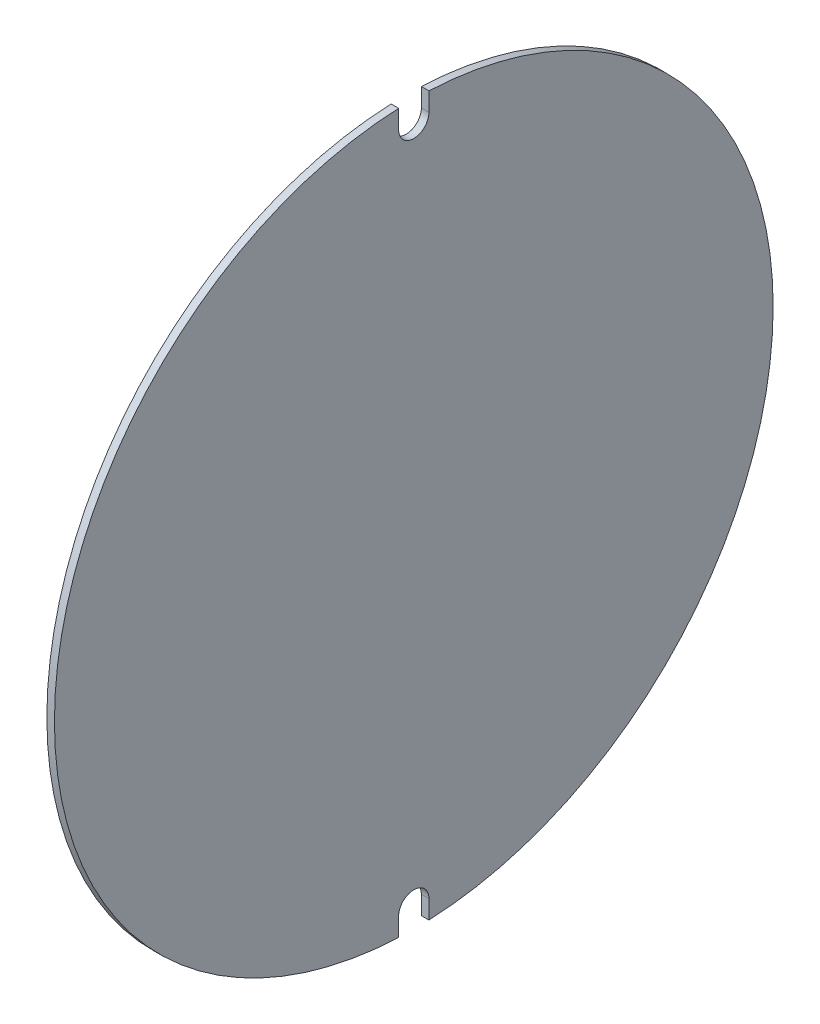
ISO-10303-21;
HEADER;
FILE_DESCRIPTION(('STEP AP214'),'2;1');
FILE_NAME('part.step','',(''),(''),'','','');
FILE_SCHEMA(('AUTOMOTIVE_DESIGN { 1 0 10303 214 1 1 1 1 }'));
ENDSEC;
DATA;
#1=APPLICATION_CONTEXT('core data for automotive mechanical design processes');
#2=APPLICATION_PROTOCOL_DEFINITION('international standard','automotive_design',2000,#1);
#3=PRODUCT_CONTEXT('',#1,'mechanical');
#4=PRODUCT('Part','Part','',(#3));
#5=PRODUCT_RELATED_PRODUCT_CATEGORY('part','',(#4));
#6=PRODUCT_DEFINITION_FORMATION('','',#4);
#7=PRODUCT_DEFINITION_CONTEXT('part definition',#1,'design');
#8=PRODUCT_DEFINITION('design','',#6,#7);
#9=PRODUCT_DEFINITION_SHAPE('','',#8);
#10=(LENGTH_UNIT() NAMED_UNIT(*) SI_UNIT(.MILLI.,.METRE.));
#11=(NAMED_UNIT(*) PLANE_ANGLE_UNIT() SI_UNIT($,.RADIAN.));
#12=(NAMED_UNIT(*) SI_UNIT($,.STERADIAN.) SOLID_ANGLE_UNIT());
#13=UNCERTAINTY_MEASURE_WITH_UNIT(LENGTH_MEASURE(1.E-05),#10,'distance_accuracy_value','');
#14=(GEOMETRIC_REPRESENTATION_CONTEXT(3) GLOBAL_UNCERTAINTY_ASSIGNED_CONTEXT((#13)) GLOBAL_UNIT_ASSIGNED_CONTEXT((#10,
#11,#12)) REPRESENTATION_CONTEXT('',''));
#15=CARTESIAN_POINT('',(0.,0.,0.));
#16=DIRECTION('',(0.,0.,1.));
#17=DIRECTION('',(1.,0.,0.));
#18=AXIS2_PLACEMENT_3D('',#15,#16,#17);
#19=CARTESIAN_POINT('',(0.,1.24344978758018E-13,0.));
#20=DIRECTION('',(1.,0.,0.));
#21=DIRECTION('',(0.,1.,0.));
#22=AXIS2_PLACEMENT_3D('',#19,#20,#21);
#23=PLANE('',#22);
#24=DIRECTION('',(0.,1.,0.));
#25=VECTOR('',#24,1.);
#26=CARTESIAN_POINT('',(0.,-47.4578760586691,2.0000000000001));
#27=LINE('',#26,#25);
#28=CARTESIAN_POINT('',(0.,-47.4578760586691,2.0000000000001));
#29=VERTEX_POINT('',#28);
#30=CARTESIAN_POINT('',(0.,-45.,2.));
#31=VERTEX_POINT('',#30);
#32=EDGE_CURVE('E28',#29,#31,#27,.T.);
#33=ORIENTED_EDGE('',*,*,#32,.F.);
#34=CARTESIAN_POINT('',(0.,0.,0.));
#35=DIRECTION('',(1.,0.,0.));
#36=DIRECTION('',(0.,0.999113180182513,0.0421052631577773));
#37=AXIS2_PLACEMENT_3D('',#34,#35,#36);
#38=CIRCLE('',#37,47.5);
#39=CARTESIAN_POINT('',(0.,47.4578760586694,1.99999999999442));
#40=VERTEX_POINT('',#39);
#41=EDGE_CURVE('E124',#40,#29,#38,.T.);
#42=ORIENTED_EDGE('',*,*,#41,.F.);
#43=DIRECTION('',(0.,1.,0.));
#44=VECTOR('',#43,1.);
#45=CARTESIAN_POINT('',(0.,44.9555335859783,1.99999999999457));
#46=LINE('',#45,#44);
#47=CARTESIAN_POINT('',(0.,45.,2.));
#48=VERTEX_POINT('',#47);
#49=EDGE_CURVE('E106',#48,#40,#46,.T.);
#50=ORIENTED_EDGE('',*,*,#49,.F.);
#51=CARTESIAN_POINT('',(0.,45.,0.));
#52=DIRECTION('',(-1.,0.,0.));
#53=DIRECTION('',(0.,0.,-1.));
#54=AXIS2_PLACEMENT_3D('',#51,#52,#53);
#55=CIRCLE('',#54,2.);
#56=CARTESIAN_POINT('',(0.,45.,-2.));
#57=VERTEX_POINT('',#56);
#58=EDGE_CURVE('E165',#57,#48,#55,.T.);
#59=ORIENTED_EDGE('',*,*,#58,.F.);
#60=DIRECTION('',(0.,-1.,0.));
#61=VECTOR('',#60,1.);
#62=CARTESIAN_POINT('',(0.,47.4578760586692,-1.99999999999777));
#63=LINE('',#62,#61);
#64=CARTESIAN_POINT('',(0.,47.4578760586692,-1.99999999999777));
#65=VERTEX_POINT('',#64);
#66=EDGE_CURVE('E155',#65,#57,#63,.T.);
#67=ORIENTED_EDGE('',*,*,#66,.F.);
#68=CARTESIAN_POINT('',(0.,0.,0.));
#69=DIRECTION('',(1.,0.,0.));
#70=DIRECTION('',(0.,-0.999113180182508,-0.0421052631578962));
#71=AXIS2_PLACEMENT_3D('',#68,#69,#70);
#72=CIRCLE('',#71,47.5);
#73=CARTESIAN_POINT('',(0.,-47.4578760586691,-2.00000000000007));
#74=VERTEX_POINT('',#73);
#75=EDGE_CURVE('E137',#74,#65,#72,.T.);
#76=ORIENTED_EDGE('',*,*,#75,.F.);
#77=DIRECTION('',(0.,-1.,0.));
#78=VECTOR('',#77,1.);
#79=CARTESIAN_POINT('',(0.,-44.9555335859781,-2.));
#80=LINE('',#79,#78);
#81=CARTESIAN_POINT('',(0.,-45.,-2.));
#82=VERTEX_POINT('',#81);
#83=EDGE_CURVE('E132',#82,#74,#80,.T.);
#84=ORIENTED_EDGE('',*,*,#83,.F.);
#85=CARTESIAN_POINT('',(0.,-45.,0.));
#86=DIRECTION('',(-1.,0.,0.));
#87=DIRECTION('',(0.,0.,1.));
#88=AXIS2_PLACEMENT_3D('',#85,#86,#87);
#89=CIRCLE('',#88,2.);
#90=EDGE_CURVE('E150',#31,#82,#89,.T.);
#91=ORIENTED_EDGE('',*,*,#90,.F.);
#92=EDGE_LOOP('',(#33,#42,#50,#59,#67,#76,#84,#91));
#93=FACE_BOUND('',#92,.T.);
#94=ADVANCED_FACE('F17',(#93),#23,.F.);
#95=CARTESIAN_POINT('',(1.,1.24344978758018E-13,0.));
#96=DIRECTION('',(1.,0.,0.));
#97=DIRECTION('',(0.,1.,0.));
#98=AXIS2_PLACEMENT_3D('',#95,#96,#97);
#99=PLANE('',#98);
#100=DIRECTION('',(0.,1.,0.));
#101=VECTOR('',#100,1.);
#102=CARTESIAN_POINT('',(1.,-47.4578760586691,2.0000000000001));
#103=LINE('',#102,#101);
#104=CARTESIAN_POINT('',(1.,-47.4578760586691,2.0000000000001));
#105=VERTEX_POINT('',#104);
#106=CARTESIAN_POINT('',(1.,-45.,2.));
#107=VERTEX_POINT('',#106);
#108=EDGE_CURVE('E11',#105,#107,#103,.T.);
#109=ORIENTED_EDGE('',*,*,#108,.T.);
#110=CARTESIAN_POINT('',(1.,-45.,0.));
#111=DIRECTION('',(-1.,0.,0.));
#112=DIRECTION('',(0.,0.,1.));
#113=AXIS2_PLACEMENT_3D('',#110,#111,#112);
#114=CIRCLE('',#113,2.);
#115=CARTESIAN_POINT('',(1.,-45.,-2.));
#116=VERTEX_POINT('',#115);
#117=EDGE_CURVE('E146',#107,#116,#114,.T.);
#118=ORIENTED_EDGE('',*,*,#117,.T.);
#119=DIRECTION('',(0.,-1.,0.));
#120=VECTOR('',#119,1.);
#121=CARTESIAN_POINT('',(1.,-44.9555335859781,-2.));
#122=LINE('',#121,#120);
#123=CARTESIAN_POINT('',(1.,-47.4578760586691,-2.00000000000007));
#124=VERTEX_POINT('',#123);
#125=EDGE_CURVE('E138',#116,#124,#122,.T.);
#126=ORIENTED_EDGE('',*,*,#125,.T.);
#127=CARTESIAN_POINT('',(1.,0.,0.));
#128=DIRECTION('',(1.,0.,0.));
#129=DIRECTION('',(0.,-0.999113180182508,-0.0421052631578962));
#130=AXIS2_PLACEMENT_3D('',#127,#128,#129);
#131=CIRCLE('',#130,47.5);
#132=CARTESIAN_POINT('',(1.,47.4578760586692,-1.99999999999777));
#133=VERTEX_POINT('',#132);
#134=EDGE_CURVE('E133',#124,#133,#131,.T.);
#135=ORIENTED_EDGE('',*,*,#134,.T.);
#136=DIRECTION('',(0.,-1.,0.));
#137=VECTOR('',#136,1.);
#138=CARTESIAN_POINT('',(1.,47.4578760586692,-1.99999999999777));
#139=LINE('',#138,#137);
#140=CARTESIAN_POINT('',(1.,45.,-2.));
#141=VERTEX_POINT('',#140);
#142=EDGE_CURVE('E162',#133,#141,#139,.T.);
#143=ORIENTED_EDGE('',*,*,#142,.T.);
#144=CARTESIAN_POINT('',(1.,45.,0.));
#145=DIRECTION('',(-1.,0.,0.));
#146=DIRECTION('',(0.,0.,-1.));
#147=AXIS2_PLACEMENT_3D('',#144,#145,#146);
#148=CIRCLE('',#147,2.);
#149=CARTESIAN_POINT('',(1.,45.,2.));
#150=VERTEX_POINT('',#149);
#151=EDGE_CURVE('E100',#141,#150,#148,.T.);
#152=ORIENTED_EDGE('',*,*,#151,.T.);
#153=DIRECTION('',(0.,1.,0.));
#154=VECTOR('',#153,1.);
#155=CARTESIAN_POINT('',(1.,44.9555335859783,1.99999999999457));
#156=LINE('',#155,#154);
#157=CARTESIAN_POINT('',(1.,47.4578760586694,1.99999999999442));
#158=VERTEX_POINT('',#157);
#159=EDGE_CURVE('E93',#150,#158,#156,.T.);
#160=ORIENTED_EDGE('',*,*,#159,.T.);
#161=CARTESIAN_POINT('',(1.,0.,0.));
#162=DIRECTION('',(1.,0.,0.));
#163=DIRECTION('',(0.,0.999113180182513,0.0421052631577773));
#164=AXIS2_PLACEMENT_3D('',#161,#162,#163);
#165=CIRCLE('',#164,47.5);
#166=EDGE_CURVE('E97',#158,#105,#165,.T.);
#167=ORIENTED_EDGE('',*,*,#166,.T.);
#168=EDGE_LOOP('',(#109,#118,#126,#135,#143,#152,#160,#167));
#169=FACE_BOUND('',#168,.T.);
#170=ADVANCED_FACE('F95',(#169),#99,.T.);
#171=CARTESIAN_POINT('',(0.,-47.4578760586691,2.0000000000001));
#172=DIRECTION('',(0.,0.,-1.));
#173=DIRECTION('',(0.,-1.,0.));
#174=AXIS2_PLACEMENT_3D('',#171,#172,#173);
#175=PLANE('',#174);
#176=ORIENTED_EDGE('',*,*,#32,.T.);
#177=DIRECTION('',(1.,0.,0.));
#178=VECTOR('',#177,1.);
#179=CARTESIAN_POINT('',(0.,-45.,2.));
#180=LINE('',#179,#178);
#181=EDGE_CURVE('E149',#31,#107,#180,.T.);
#182=ORIENTED_EDGE('',*,*,#181,.T.);
#183=ORIENTED_EDGE('',*,*,#108,.F.);
#184=DIRECTION('',(1.,0.,0.));
#185=VECTOR('',#184,1.);
#186=CARTESIAN_POINT('',(0.,-47.4578760586691,2.0000000000001));
#187=LINE('',#186,#185);
#188=EDGE_CURVE('E117',#29,#105,#187,.T.);
#189=ORIENTED_EDGE('',*,*,#188,.F.);
#190=EDGE_LOOP('',(#176,#182,#183,#189));
#191=FACE_BOUND('',#190,.T.);
#192=ADVANCED_FACE('F216',(#191),#175,.T.);
#193=CARTESIAN_POINT('',(0.,-45.,0.));
#194=DIRECTION('',(1.,0.,0.));
#195=DIRECTION('',(0.,0.,1.));
#196=AXIS2_PLACEMENT_3D('',#193,#194,#195);
#197=CYLINDRICAL_SURFACE('',#196,2.);
#198=ORIENTED_EDGE('',*,*,#90,.T.);
#199=DIRECTION('',(1.,0.,0.));
#200=VECTOR('',#199,1.);
#201=CARTESIAN_POINT('',(0.,-45.,-2.));
#202=LINE('',#201,#200);
#203=EDGE_CURVE('E141',#82,#116,#202,.T.);
#204=ORIENTED_EDGE('',*,*,#203,.T.);
#205=ORIENTED_EDGE('',*,*,#117,.F.);
#206=ORIENTED_EDGE('',*,*,#181,.F.);
#207=EDGE_LOOP('',(#198,#204,#205,#206));
#208=FACE_BOUND('',#207,.T.);
#209=ADVANCED_FACE('F219',(#208),#197,.F.);
#210=CARTESIAN_POINT('',(0.,-45.,-2.));
#211=DIRECTION('',(0.,0.,1.));
#212=DIRECTION('',(0.,-1.,0.));
#213=AXIS2_PLACEMENT_3D('',#210,#211,#212);
#214=PLANE('',#213);
#215=ORIENTED_EDGE('',*,*,#83,.T.);
#216=DIRECTION('',(1.,0.,0.));
#217=VECTOR('',#216,1.);
#218=CARTESIAN_POINT('',(0.,-47.4578760586691,-2.00000000000007));
#219=LINE('',#218,#217);
#220=EDGE_CURVE('E130',#74,#124,#219,.T.);
#221=ORIENTED_EDGE('',*,*,#220,.T.);
#222=ORIENTED_EDGE('',*,*,#125,.F.);
#223=ORIENTED_EDGE('',*,*,#203,.F.);
#224=EDGE_LOOP('',(#215,#221,#222,#223));
#225=FACE_BOUND('',#224,.T.);
#226=ADVANCED_FACE('F180',(#225),#214,.T.);
#227=CARTESIAN_POINT('',(0.,0.,0.));
#228=DIRECTION('',(1.,0.,0.));
#229=DIRECTION('',(0.,-0.999113180182508,-0.0421052631578962));
#230=AXIS2_PLACEMENT_3D('',#227,#228,#229);
#231=CYLINDRICAL_SURFACE('',#230,47.5);
#232=ORIENTED_EDGE('',*,*,#75,.T.);
#233=DIRECTION('',(1.,0.,0.));
#234=VECTOR('',#233,1.);
#235=CARTESIAN_POINT('',(0.,47.4578760586692,-1.99999999999777));
#236=LINE('',#235,#234);
#237=EDGE_CURVE('E128',#65,#133,#236,.T.);
#238=ORIENTED_EDGE('',*,*,#237,.T.);
#239=ORIENTED_EDGE('',*,*,#134,.F.);
#240=ORIENTED_EDGE('',*,*,#220,.F.);
#241=EDGE_LOOP('',(#232,#238,#239,#240));
#242=FACE_BOUND('',#241,.T.);
#243=ADVANCED_FACE('F188',(#242),#231,.T.);
#244=CARTESIAN_POINT('',(0.,47.4578760586692,-1.99999999999777));
#245=DIRECTION('',(0.,0.,1.));
#246=DIRECTION('',(0.,-1.,0.));
#247=AXIS2_PLACEMENT_3D('',#244,#245,#246);
#248=PLANE('',#247);
#249=ORIENTED_EDGE('',*,*,#66,.T.);
#250=DIRECTION('',(1.,0.,0.));
#251=VECTOR('',#250,1.);
#252=CARTESIAN_POINT('',(0.,45.,-2.));
#253=LINE('',#252,#251);
#254=EDGE_CURVE('E152',#57,#141,#253,.T.);
#255=ORIENTED_EDGE('',*,*,#254,.T.);
#256=ORIENTED_EDGE('',*,*,#142,.F.);
#257=ORIENTED_EDGE('',*,*,#237,.F.);
#258=EDGE_LOOP('',(#249,#255,#256,#257));
#259=FACE_BOUND('',#258,.T.);
#260=ADVANCED_FACE('F193',(#259),#248,.T.);
#261=CARTESIAN_POINT('',(0.,45.,0.));
#262=DIRECTION('',(1.,0.,0.));
#263=DIRECTION('',(0.,0.,-1.));
#264=AXIS2_PLACEMENT_3D('',#261,#262,#263);
#265=CYLINDRICAL_SURFACE('',#264,2.);
#266=ORIENTED_EDGE('',*,*,#58,.T.);
#267=DIRECTION('',(1.,0.,0.));
#268=VECTOR('',#267,1.);
#269=CARTESIAN_POINT('',(0.,45.,2.));
#270=LINE('',#269,#268);
#271=EDGE_CURVE('E105',#48,#150,#270,.T.);
#272=ORIENTED_EDGE('',*,*,#271,.T.);
#273=ORIENTED_EDGE('',*,*,#151,.F.);
#274=ORIENTED_EDGE('',*,*,#254,.F.);
#275=EDGE_LOOP('',(#266,#272,#273,#274));
#276=FACE_BOUND('',#275,.T.);
#277=ADVANCED_FACE('F19',(#276),#265,.F.);
#278=CARTESIAN_POINT('',(0.,45.,1.99999999999457));
#279=DIRECTION('',(0.,0.,-1.));
#280=DIRECTION('',(0.,-1.,0.));
#281=AXIS2_PLACEMENT_3D('',#278,#279,#280);
#282=PLANE('',#281);
#283=ORIENTED_EDGE('',*,*,#49,.T.);
#284=DIRECTION('',(1.,0.,0.));
#285=VECTOR('',#284,1.);
#286=CARTESIAN_POINT('',(0.,47.4578760586694,1.99999999999442));
#287=LINE('',#286,#285);
#288=EDGE_CURVE('E21',#40,#158,#287,.T.);
#289=ORIENTED_EDGE('',*,*,#288,.T.);
#290=ORIENTED_EDGE('',*,*,#159,.F.);
#291=ORIENTED_EDGE('',*,*,#271,.F.);
#292=EDGE_LOOP('',(#283,#289,#290,#291));
#293=FACE_BOUND('',#292,.T.);
#294=ADVANCED_FACE('F109',(#293),#282,.T.);
#295=CARTESIAN_POINT('',(0.,0.,0.));
#296=DIRECTION('',(1.,0.,0.));
#297=DIRECTION('',(0.,0.999113180182513,0.0421052631577773));
#298=AXIS2_PLACEMENT_3D('',#295,#296,#297);
#299=CYLINDRICAL_SURFACE('',#298,47.5);
#300=ORIENTED_EDGE('',*,*,#41,.T.);
#301=ORIENTED_EDGE('',*,*,#188,.T.);
#302=ORIENTED_EDGE('',*,*,#166,.F.);
#303=ORIENTED_EDGE('',*,*,#288,.F.);
#304=EDGE_LOOP('',(#300,#301,#302,#303));
#305=FACE_BOUND('',#304,.T.);
#306=ADVANCED_FACE('F115',(#305),#299,.T.);
#307=CLOSED_SHELL('',(#94,#170,#192,#209,#226,#243,#260,#277,#294,#306));
#308=MANIFOLD_SOLID_BREP('B1',#307);
#309=ADVANCED_BREP_SHAPE_REPRESENTATION('',(#18,#308),#14);
#310=SHAPE_DEFINITION_REPRESENTATION(#9,#309);
ENDSEC;
END-ISO-10303-21;
